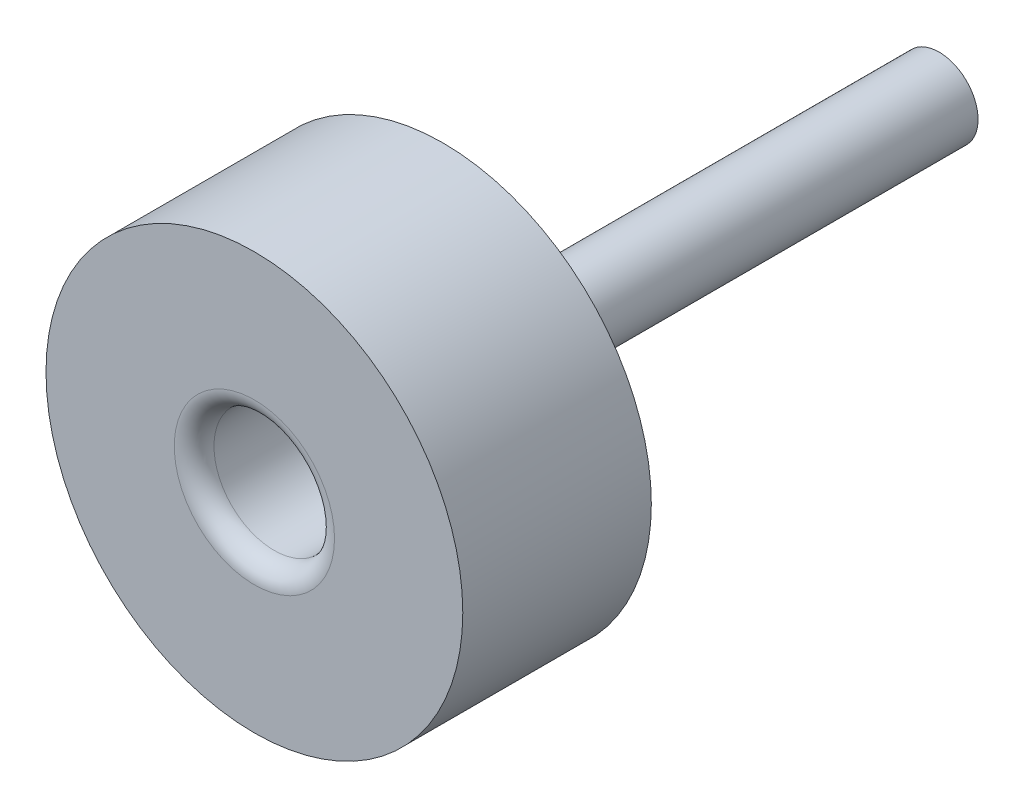
ISO-10303-21;
HEADER;
FILE_DESCRIPTION(('STEP AP214'),'2;1');
FILE_NAME('part.step','',(''),(''),'','','');
FILE_SCHEMA(('AUTOMOTIVE_DESIGN { 1 0 10303 214 1 1 1 1 }'));
ENDSEC;
DATA;
#1=APPLICATION_CONTEXT('core data for automotive mechanical design processes');
#2=APPLICATION_PROTOCOL_DEFINITION('international standard','automotive_design',2000,#1);
#3=PRODUCT_CONTEXT('',#1,'mechanical');
#4=PRODUCT('Part','Part','',(#3));
#5=PRODUCT_RELATED_PRODUCT_CATEGORY('part','',(#4));
#6=PRODUCT_DEFINITION_FORMATION('','',#4);
#7=PRODUCT_DEFINITION_CONTEXT('part definition',#1,'design');
#8=PRODUCT_DEFINITION('design','',#6,#7);
#9=PRODUCT_DEFINITION_SHAPE('','',#8);
#10=(LENGTH_UNIT() NAMED_UNIT(*) SI_UNIT(.MILLI.,.METRE.));
#11=(NAMED_UNIT(*) PLANE_ANGLE_UNIT() SI_UNIT($,.RADIAN.));
#12=(NAMED_UNIT(*) SI_UNIT($,.STERADIAN.) SOLID_ANGLE_UNIT());
#13=UNCERTAINTY_MEASURE_WITH_UNIT(LENGTH_MEASURE(1.E-05),#10,'distance_accuracy_value','');
#14=(GEOMETRIC_REPRESENTATION_CONTEXT(3) GLOBAL_UNCERTAINTY_ASSIGNED_CONTEXT((#13)) GLOBAL_UNIT_ASSIGNED_CONTEXT((#10,
#11,#12)) REPRESENTATION_CONTEXT('',''));
#15=CARTESIAN_POINT('',(0.,0.,0.));
#16=DIRECTION('',(0.,0.,1.));
#17=DIRECTION('',(1.,0.,0.));
#18=AXIS2_PLACEMENT_3D('',#15,#16,#17);
#19=CARTESIAN_POINT('',(0.,0.,9.));
#20=DIRECTION('',(0.,0.,-1.));
#21=DIRECTION('',(-1.,0.,0.));
#22=AXIS2_PLACEMENT_3D('',#19,#20,#21);
#23=CYLINDRICAL_SURFACE('',#22,6.);
#24=CARTESIAN_POINT('',(0.,0.,9.));
#25=DIRECTION('',(0.,0.,1.));
#26=DIRECTION('',(1.,0.,0.));
#27=AXIS2_PLACEMENT_3D('',#24,#25,#26);
#28=CIRCLE('',#27,6.);
#29=CARTESIAN_POINT('',(6.,0.,9.));
#30=VERTEX_POINT('',#29);
#31=EDGE_CURVE('E61',#30,#30,#28,.T.);
#32=ORIENTED_EDGE('',*,*,#31,.F.);
#33=EDGE_LOOP('',(#32));
#34=FACE_BOUND('',#33,.T.);
#35=CARTESIAN_POINT('',(0.,0.,0.));
#36=DIRECTION('',(0.,0.,1.));
#37=DIRECTION('',(1.,0.,0.));
#38=AXIS2_PLACEMENT_3D('',#35,#36,#37);
#39=CIRCLE('',#38,6.);
#40=CARTESIAN_POINT('',(6.,0.,0.));
#41=VERTEX_POINT('',#40);
#42=EDGE_CURVE('E64',#41,#41,#39,.T.);
#43=ORIENTED_EDGE('',*,*,#42,.T.);
#44=EDGE_LOOP('',(#43));
#45=FACE_BOUND('',#44,.T.);
#46=ADVANCED_FACE('F43',(#34,#45),#23,.T.);
#47=CARTESIAN_POINT('',(0.,0.,0.));
#48=DIRECTION('',(0.,0.,1.));
#49=DIRECTION('',(1.,0.,0.));
#50=AXIS2_PLACEMENT_3D('',#47,#48,#49);
#51=PLANE('',#50);
#52=CARTESIAN_POINT('',(0.,0.,0.));
#53=DIRECTION('',(0.,0.,-1.));
#54=DIRECTION('',(-1.,0.,0.));
#55=AXIS2_PLACEMENT_3D('',#52,#53,#54);
#56=CIRCLE('',#55,3.925);
#57=CARTESIAN_POINT('',(-3.925,0.,0.));
#58=VERTEX_POINT('',#57);
#59=EDGE_CURVE('E56',#58,#58,#56,.T.);
#60=ORIENTED_EDGE('',*,*,#59,.F.);
#61=EDGE_LOOP('',(#60));
#62=FACE_BOUND('',#61,.T.);
#63=ORIENTED_EDGE('',*,*,#42,.F.);
#64=EDGE_LOOP('',(#63));
#65=FACE_BOUND('',#64,.T.);
#66=ADVANCED_FACE('F114',(#62,#65),#51,.F.);
#67=CARTESIAN_POINT('',(0.,0.,-41.));
#68=DIRECTION('',(0.,0.,1.));
#69=DIRECTION('',(1.,0.,0.));
#70=AXIS2_PLACEMENT_3D('',#67,#68,#69);
#71=CYLINDRICAL_SURFACE('',#70,3.925);
#72=CARTESIAN_POINT('',(0.,0.,-41.));
#73=DIRECTION('',(0.,0.,-1.));
#74=DIRECTION('',(-1.,0.,0.));
#75=AXIS2_PLACEMENT_3D('',#72,#73,#74);
#76=CIRCLE('',#75,3.925);
#77=CARTESIAN_POINT('',(-3.925,0.,-41.));
#78=VERTEX_POINT('',#77);
#79=EDGE_CURVE('E68',#78,#78,#76,.T.);
#80=ORIENTED_EDGE('',*,*,#79,.F.);
#81=EDGE_LOOP('',(#80));
#82=FACE_BOUND('',#81,.T.);
#83=ORIENTED_EDGE('',*,*,#59,.T.);
#84=EDGE_LOOP('',(#83));
#85=FACE_BOUND('',#84,.T.);
#86=ADVANCED_FACE('F108',(#82,#85),#71,.T.);
#87=CARTESIAN_POINT('',(0.,0.,-41.));
#88=DIRECTION('',(0.,0.,-1.));
#89=DIRECTION('',(-1.,0.,0.));
#90=AXIS2_PLACEMENT_3D('',#87,#88,#89);
#91=PLANE('',#90);
#92=CARTESIAN_POINT('',(0.,0.,-41.));
#93=DIRECTION('',(0.,0.,-1.));
#94=DIRECTION('',(-1.,0.,0.));
#95=AXIS2_PLACEMENT_3D('',#92,#93,#94);
#96=CIRCLE('',#95,1.5);
#97=CARTESIAN_POINT('',(-1.5,0.,-41.));
#98=VERTEX_POINT('',#97);
#99=EDGE_CURVE('E88',#98,#98,#96,.T.);
#100=ORIENTED_EDGE('',*,*,#99,.F.);
#101=EDGE_LOOP('',(#100));
#102=FACE_BOUND('',#101,.T.);
#103=ORIENTED_EDGE('',*,*,#79,.T.);
#104=EDGE_LOOP('',(#103));
#105=FACE_BOUND('',#104,.T.);
#106=ADVANCED_FACE('F104',(#102,#105),#91,.T.);
#107=CARTESIAN_POINT('',(0.,0.,28.));
#108=DIRECTION('',(0.,0.,-1.));
#109=DIRECTION('',(-1.,0.,0.));
#110=AXIS2_PLACEMENT_3D('',#107,#108,#109);
#111=CYLINDRICAL_SURFACE('',#110,21.);
#112=CARTESIAN_POINT('',(0.,0.,28.));
#113=DIRECTION('',(0.,0.,1.));
#114=DIRECTION('',(1.,0.,0.));
#115=AXIS2_PLACEMENT_3D('',#112,#113,#114);
#116=CIRCLE('',#115,21.);
#117=CARTESIAN_POINT('',(21.,0.,28.));
#118=VERTEX_POINT('',#117);
#119=EDGE_CURVE('E75',#118,#118,#116,.T.);
#120=ORIENTED_EDGE('',*,*,#119,.F.);
#121=EDGE_LOOP('',(#120));
#122=FACE_BOUND('',#121,.T.);
#123=CARTESIAN_POINT('',(0.,0.,9.));
#124=DIRECTION('',(0.,0.,1.));
#125=DIRECTION('',(1.,0.,0.));
#126=AXIS2_PLACEMENT_3D('',#123,#124,#125);
#127=CIRCLE('',#126,21.);
#128=CARTESIAN_POINT('',(21.,0.,9.));
#129=VERTEX_POINT('',#128);
#130=EDGE_CURVE('E76',#129,#129,#127,.T.);
#131=ORIENTED_EDGE('',*,*,#130,.T.);
#132=EDGE_LOOP('',(#131));
#133=FACE_BOUND('',#132,.T.);
#134=ADVANCED_FACE('F107',(#122,#133),#111,.T.);
#135=CARTESIAN_POINT('',(0.,0.,28.));
#136=DIRECTION('',(0.,0.,1.));
#137=DIRECTION('',(1.,0.,0.));
#138=AXIS2_PLACEMENT_3D('',#135,#136,#137);
#139=PLANE('',#138);
#140=CARTESIAN_POINT('',(0.,0.,28.));
#141=DIRECTION('',(0.,0.,1.));
#142=DIRECTION('',(1.,0.,0.));
#143=AXIS2_PLACEMENT_3D('',#140,#141,#142);
#144=CIRCLE('',#143,8.075);
#145=CARTESIAN_POINT('',(8.075,0.,28.));
#146=VERTEX_POINT('',#145);
#147=EDGE_CURVE('E10',#146,#146,#144,.F.);
#148=ORIENTED_EDGE('',*,*,#147,.T.);
#149=EDGE_LOOP('',(#148));
#150=FACE_BOUND('',#149,.T.);
#151=ORIENTED_EDGE('',*,*,#119,.T.);
#152=EDGE_LOOP('',(#151));
#153=FACE_BOUND('',#152,.T.);
#154=ADVANCED_FACE('F131',(#150,#153),#139,.T.);
#155=CARTESIAN_POINT('',(0.,0.,9.));
#156=DIRECTION('',(0.,0.,1.));
#157=DIRECTION('',(1.,0.,0.));
#158=AXIS2_PLACEMENT_3D('',#155,#156,#157);
#159=PLANE('',#158);
#160=ORIENTED_EDGE('',*,*,#31,.T.);
#161=EDGE_LOOP('',(#160));
#162=FACE_BOUND('',#161,.T.);
#163=ORIENTED_EDGE('',*,*,#130,.F.);
#164=EDGE_LOOP('',(#163));
#165=FACE_BOUND('',#164,.T.);
#166=ADVANCED_FACE('F133',(#162,#165),#159,.F.);
#167=CARTESIAN_POINT('',(0.,0.,18.));
#168=DIRECTION('',(0.,0.,1.));
#169=DIRECTION('',(1.,0.,0.));
#170=AXIS2_PLACEMENT_3D('',#167,#168,#169);
#171=CYLINDRICAL_SURFACE('',#170,6.075);
#172=CARTESIAN_POINT('',(0.,0.,26.));
#173=DIRECTION('',(0.,0.,1.));
#174=DIRECTION('',(1.,0.,0.));
#175=AXIS2_PLACEMENT_3D('',#172,#173,#174);
#176=CIRCLE('',#175,6.075);
#177=CARTESIAN_POINT('',(6.075,0.,26.));
#178=VERTEX_POINT('',#177);
#179=EDGE_CURVE('E51',#178,#178,#176,.T.);
#180=ORIENTED_EDGE('',*,*,#179,.T.);
#181=EDGE_LOOP('',(#180));
#182=FACE_BOUND('',#181,.T.);
#183=CARTESIAN_POINT('',(0.,0.,18.));
#184=DIRECTION('',(0.,0.,1.));
#185=DIRECTION('',(1.,0.,0.));
#186=AXIS2_PLACEMENT_3D('',#183,#184,#185);
#187=CIRCLE('',#186,6.075);
#188=CARTESIAN_POINT('',(6.075,0.,18.));
#189=VERTEX_POINT('',#188);
#190=EDGE_CURVE('E80',#189,#189,#187,.T.);
#191=ORIENTED_EDGE('',*,*,#190,.F.);
#192=EDGE_LOOP('',(#191));
#193=FACE_BOUND('',#192,.T.);
#194=ADVANCED_FACE('F136',(#182,#193),#171,.F.);
#195=CARTESIAN_POINT('',(0.,0.,18.));
#196=DIRECTION('',(0.,0.,1.));
#197=DIRECTION('',(1.,0.,0.));
#198=AXIS2_PLACEMENT_3D('',#195,#196,#197);
#199=PLANE('',#198);
#200=ORIENTED_EDGE('',*,*,#190,.T.);
#201=EDGE_LOOP('',(#200));
#202=FACE_BOUND('',#201,.T.);
#203=ADVANCED_FACE('F142',(#202),#199,.T.);
#204=CARTESIAN_POINT('',(0.,0.,26.));
#205=DIRECTION('',(0.,0.,1.));
#206=DIRECTION('',(1.,0.,0.));
#207=AXIS2_PLACEMENT_3D('',#204,#205,#206);
#208=TOROIDAL_SURFACE('',#207,8.075,2.);
#209=ORIENTED_EDGE('',*,*,#147,.F.);
#210=EDGE_LOOP('',(#209));
#211=FACE_BOUND('',#210,.T.);
#212=ORIENTED_EDGE('',*,*,#179,.F.);
#213=EDGE_LOOP('',(#212));
#214=FACE_BOUND('',#213,.T.);
#215=ADVANCED_FACE('F45',(#211,#214),#208,.T.);
#216=CARTESIAN_POINT('',(0.,0.,-26.));
#217=DIRECTION('',(0.,0.,-1.));
#218=DIRECTION('',(-1.,0.,0.));
#219=AXIS2_PLACEMENT_3D('',#216,#217,#218);
#220=CYLINDRICAL_SURFACE('',#219,1.5);
#221=CARTESIAN_POINT('',(0.,0.,-26.));
#222=DIRECTION('',(0.,0.,-1.));
#223=DIRECTION('',(-1.,0.,0.));
#224=AXIS2_PLACEMENT_3D('',#221,#222,#223);
#225=CIRCLE('',#224,1.5);
#226=CARTESIAN_POINT('',(-1.5,0.,-26.));
#227=VERTEX_POINT('',#226);
#228=EDGE_CURVE('E87',#227,#227,#225,.T.);
#229=ORIENTED_EDGE('',*,*,#228,.F.);
#230=EDGE_LOOP('',(#229));
#231=FACE_BOUND('',#230,.T.);
#232=ORIENTED_EDGE('',*,*,#99,.T.);
#233=EDGE_LOOP('',(#232));
#234=FACE_BOUND('',#233,.T.);
#235=ADVANCED_FACE('F98',(#231,#234),#220,.F.);
#236=CARTESIAN_POINT('',(0.,0.,-26.));
#237=DIRECTION('',(0.,0.,-1.));
#238=DIRECTION('',(-1.,0.,0.));
#239=AXIS2_PLACEMENT_3D('',#236,#237,#238);
#240=PLANE('',#239);
#241=ORIENTED_EDGE('',*,*,#228,.T.);
#242=EDGE_LOOP('',(#241));
#243=FACE_BOUND('',#242,.T.);
#244=ADVANCED_FACE('F96',(#243),#240,.T.);
#245=CLOSED_SHELL('',(#46,#66,#86,#106,#134,#154,#166,#194,#203,#215,#235,#244));
#246=MANIFOLD_SOLID_BREP('B2',#245);
#247=ADVANCED_BREP_SHAPE_REPRESENTATION('',(#18,#246),#14);
#248=SHAPE_DEFINITION_REPRESENTATION(#9,#247);
ENDSEC;
END-ISO-10303-21;
